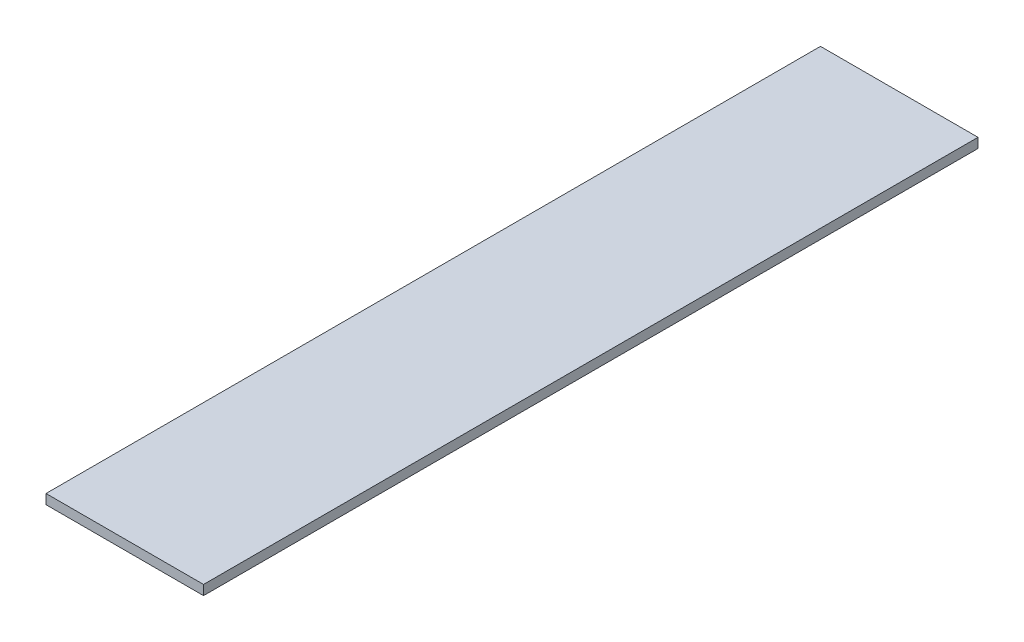
ISO-10303-21;
HEADER;
FILE_DESCRIPTION(('STEP AP214'),'2;1');
FILE_NAME('part.step','',(''),(''),'','','');
FILE_SCHEMA(('AUTOMOTIVE_DESIGN { 1 0 10303 214 1 1 1 1 }'));
ENDSEC;
DATA;
#1=APPLICATION_CONTEXT('core data for automotive mechanical design processes');
#2=APPLICATION_PROTOCOL_DEFINITION('international standard','automotive_design',2000,#1);
#3=PRODUCT_CONTEXT('',#1,'mechanical');
#4=PRODUCT('Part','Part','',(#3));
#5=PRODUCT_RELATED_PRODUCT_CATEGORY('part','',(#4));
#6=PRODUCT_DEFINITION_FORMATION('','',#4);
#7=PRODUCT_DEFINITION_CONTEXT('part definition',#1,'design');
#8=PRODUCT_DEFINITION('design','',#6,#7);
#9=PRODUCT_DEFINITION_SHAPE('','',#8);
#10=(LENGTH_UNIT() NAMED_UNIT(*) SI_UNIT(.MILLI.,.METRE.));
#11=(NAMED_UNIT(*) PLANE_ANGLE_UNIT() SI_UNIT($,.RADIAN.));
#12=(NAMED_UNIT(*) SI_UNIT($,.STERADIAN.) SOLID_ANGLE_UNIT());
#13=UNCERTAINTY_MEASURE_WITH_UNIT(LENGTH_MEASURE(1.E-05),#10,'distance_accuracy_value','');
#14=(GEOMETRIC_REPRESENTATION_CONTEXT(3) GLOBAL_UNCERTAINTY_ASSIGNED_CONTEXT((#13)) GLOBAL_UNIT_ASSIGNED_CONTEXT((#10,
#11,#12)) REPRESENTATION_CONTEXT('',''));
#15=CARTESIAN_POINT('',(0.,0.,0.));
#16=DIRECTION('',(0.,0.,1.));
#17=DIRECTION('',(1.,0.,0.));
#18=AXIS2_PLACEMENT_3D('',#15,#16,#17);
#19=CARTESIAN_POINT('',(9.525,-0.5875,93.65));
#20=DIRECTION('',(-1.,0.,0.));
#21=DIRECTION('',(0.,0.,1.));
#22=AXIS2_PLACEMENT_3D('',#19,#20,#21);
#23=PLANE('',#22);
#24=DIRECTION('',(0.,1.,0.));
#25=VECTOR('',#24,1.);
#26=CARTESIAN_POINT('',(9.525,-0.5875,0.));
#27=LINE('',#26,#25);
#28=CARTESIAN_POINT('',(9.525,-0.5875,0.));
#29=VERTEX_POINT('',#28);
#30=CARTESIAN_POINT('',(9.525,0.587500000000001,0.));
#31=VERTEX_POINT('',#30);
#32=EDGE_CURVE('E96',#29,#31,#27,.T.);
#33=ORIENTED_EDGE('',*,*,#32,.T.);
#34=DIRECTION('',(0.,0.,-1.));
#35=VECTOR('',#34,1.);
#36=CARTESIAN_POINT('',(9.525,0.587500000000001,93.65));
#37=LINE('',#36,#35);
#38=CARTESIAN_POINT('',(9.525,0.587500000000001,93.65));
#39=VERTEX_POINT('',#38);
#40=EDGE_CURVE('E11',#39,#31,#37,.T.);
#41=ORIENTED_EDGE('',*,*,#40,.F.);
#42=DIRECTION('',(0.,1.,0.));
#43=VECTOR('',#42,1.);
#44=CARTESIAN_POINT('',(9.525,-0.5875,93.65));
#45=LINE('',#44,#43);
#46=CARTESIAN_POINT('',(9.525,-0.5875,93.65));
#47=VERTEX_POINT('',#46);
#48=EDGE_CURVE('E84',#47,#39,#45,.T.);
#49=ORIENTED_EDGE('',*,*,#48,.F.);
#50=DIRECTION('',(0.,0.,-1.));
#51=VECTOR('',#50,1.);
#52=CARTESIAN_POINT('',(9.525,-0.5875,93.65));
#53=LINE('',#52,#51);
#54=EDGE_CURVE('E92',#47,#29,#53,.T.);
#55=ORIENTED_EDGE('',*,*,#54,.T.);
#56=EDGE_LOOP('',(#33,#41,#49,#55));
#57=FACE_BOUND('',#56,.T.);
#58=ADVANCED_FACE('F33',(#57),#23,.F.);
#59=CARTESIAN_POINT('',(-9.525,0.587500000000001,93.65));
#60=DIRECTION('',(0.,-1.,0.));
#61=DIRECTION('',(0.,0.,-1.));
#62=AXIS2_PLACEMENT_3D('',#59,#60,#61);
#63=PLANE('',#62);
#64=DIRECTION('',(-1.,0.,0.));
#65=VECTOR('',#64,1.);
#66=CARTESIAN_POINT('',(-9.525,0.587500000000001,0.));
#67=LINE('',#66,#65);
#68=CARTESIAN_POINT('',(-9.525,0.587500000000001,0.));
#69=VERTEX_POINT('',#68);
#70=EDGE_CURVE('E88',#31,#69,#67,.T.);
#71=ORIENTED_EDGE('',*,*,#70,.T.);
#72=DIRECTION('',(0.,0.,-1.));
#73=VECTOR('',#72,1.);
#74=CARTESIAN_POINT('',(-9.525,0.587500000000001,93.65));
#75=LINE('',#74,#73);
#76=CARTESIAN_POINT('',(-9.525,0.587500000000001,93.65));
#77=VERTEX_POINT('',#76);
#78=EDGE_CURVE('E41',#77,#69,#75,.T.);
#79=ORIENTED_EDGE('',*,*,#78,.F.);
#80=DIRECTION('',(-1.,0.,0.));
#81=VECTOR('',#80,1.);
#82=CARTESIAN_POINT('',(-9.525,0.587500000000001,93.65));
#83=LINE('',#82,#81);
#84=EDGE_CURVE('E79',#39,#77,#83,.T.);
#85=ORIENTED_EDGE('',*,*,#84,.F.);
#86=ORIENTED_EDGE('',*,*,#40,.T.);
#87=EDGE_LOOP('',(#71,#79,#85,#86));
#88=FACE_BOUND('',#87,.T.);
#89=ADVANCED_FACE('F87',(#88),#63,.F.);
#90=CARTESIAN_POINT('',(-9.525,-0.5875,93.65));
#91=DIRECTION('',(1.,0.,0.));
#92=DIRECTION('',(0.,0.,-1.));
#93=AXIS2_PLACEMENT_3D('',#90,#91,#92);
#94=PLANE('',#93);
#95=DIRECTION('',(0.,-1.,0.));
#96=VECTOR('',#95,1.);
#97=CARTESIAN_POINT('',(-9.525,-0.5875,0.));
#98=LINE('',#97,#96);
#99=CARTESIAN_POINT('',(-9.525,-0.5875,0.));
#100=VERTEX_POINT('',#99);
#101=EDGE_CURVE('E66',#69,#100,#98,.T.);
#102=ORIENTED_EDGE('',*,*,#101,.T.);
#103=DIRECTION('',(0.,0.,-1.));
#104=VECTOR('',#103,1.);
#105=CARTESIAN_POINT('',(-9.525,-0.5875,93.65));
#106=LINE('',#105,#104);
#107=CARTESIAN_POINT('',(-9.525,-0.5875,93.65));
#108=VERTEX_POINT('',#107);
#109=EDGE_CURVE('E89',#108,#100,#106,.T.);
#110=ORIENTED_EDGE('',*,*,#109,.F.);
#111=DIRECTION('',(0.,-1.,0.));
#112=VECTOR('',#111,1.);
#113=CARTESIAN_POINT('',(-9.525,-0.5875,93.65));
#114=LINE('',#113,#112);
#115=EDGE_CURVE('E82',#77,#108,#114,.T.);
#116=ORIENTED_EDGE('',*,*,#115,.F.);
#117=ORIENTED_EDGE('',*,*,#78,.T.);
#118=EDGE_LOOP('',(#102,#110,#116,#117));
#119=FACE_BOUND('',#118,.T.);
#120=ADVANCED_FACE('F90',(#119),#94,.F.);
#121=CARTESIAN_POINT('',(-9.525,-0.5875,93.65));
#122=DIRECTION('',(0.,1.,0.));
#123=DIRECTION('',(0.,0.,1.));
#124=AXIS2_PLACEMENT_3D('',#121,#122,#123);
#125=PLANE('',#124);
#126=DIRECTION('',(1.,0.,0.));
#127=VECTOR('',#126,1.);
#128=CARTESIAN_POINT('',(-9.525,-0.5875,0.));
#129=LINE('',#128,#127);
#130=EDGE_CURVE('E72',#100,#29,#129,.T.);
#131=ORIENTED_EDGE('',*,*,#130,.T.);
#132=ORIENTED_EDGE('',*,*,#54,.F.);
#133=DIRECTION('',(1.,0.,0.));
#134=VECTOR('',#133,1.);
#135=CARTESIAN_POINT('',(-9.525,-0.5875,93.65));
#136=LINE('',#135,#134);
#137=EDGE_CURVE('E49',#108,#47,#136,.T.);
#138=ORIENTED_EDGE('',*,*,#137,.F.);
#139=ORIENTED_EDGE('',*,*,#109,.T.);
#140=EDGE_LOOP('',(#131,#132,#138,#139));
#141=FACE_BOUND('',#140,.T.);
#142=ADVANCED_FACE('F103',(#141),#125,.F.);
#143=CARTESIAN_POINT('',(0.,0.,93.65));
#144=DIRECTION('',(0.,0.,-1.));
#145=DIRECTION('',(-1.,0.,0.));
#146=AXIS2_PLACEMENT_3D('',#143,#144,#145);
#147=PLANE('',#146);
#148=ORIENTED_EDGE('',*,*,#48,.T.);
#149=ORIENTED_EDGE('',*,*,#84,.T.);
#150=ORIENTED_EDGE('',*,*,#115,.T.);
#151=ORIENTED_EDGE('',*,*,#137,.T.);
#152=EDGE_LOOP('',(#148,#149,#150,#151));
#153=FACE_BOUND('',#152,.T.);
#154=ADVANCED_FACE('F80',(#153),#147,.F.);
#155=CARTESIAN_POINT('',(0.,0.,0.));
#156=DIRECTION('',(0.,0.,-1.));
#157=DIRECTION('',(-1.,0.,0.));
#158=AXIS2_PLACEMENT_3D('',#155,#156,#157);
#159=PLANE('',#158);
#160=ORIENTED_EDGE('',*,*,#32,.F.);
#161=ORIENTED_EDGE('',*,*,#130,.F.);
#162=ORIENTED_EDGE('',*,*,#101,.F.);
#163=ORIENTED_EDGE('',*,*,#70,.F.);
#164=EDGE_LOOP('',(#160,#161,#162,#163));
#165=FACE_BOUND('',#164,.T.);
#166=ADVANCED_FACE('F106',(#165),#159,.T.);
#167=CLOSED_SHELL('',(#58,#89,#120,#142,#154,#166));
#168=MANIFOLD_SOLID_BREP('B2',#167);
#169=ADVANCED_BREP_SHAPE_REPRESENTATION('',(#18,#168),#14);
#170=SHAPE_DEFINITION_REPRESENTATION(#9,#169);
ENDSEC;
END-ISO-10303-21;
